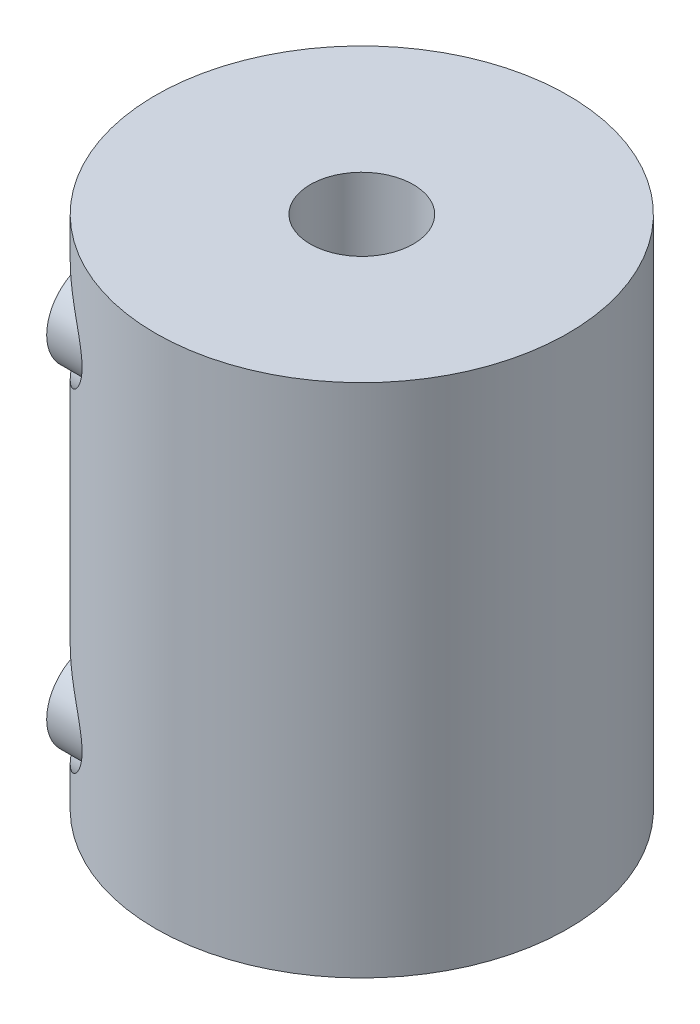
ISO-10303-21;
HEADER;
FILE_DESCRIPTION(('STEP AP214'),'2;1');
FILE_NAME('part.step','',(''),(''),'','','');
FILE_SCHEMA(('AUTOMOTIVE_DESIGN { 1 0 10303 214 1 1 1 1 }'));
ENDSEC;
DATA;
#1=APPLICATION_CONTEXT('core data for automotive mechanical design processes');
#2=APPLICATION_PROTOCOL_DEFINITION('international standard','automotive_design',2000,#1);
#3=PRODUCT_CONTEXT('',#1,'mechanical');
#4=PRODUCT('Part','Part','',(#3));
#5=PRODUCT_RELATED_PRODUCT_CATEGORY('part','',(#4));
#6=PRODUCT_DEFINITION_FORMATION('','',#4);
#7=PRODUCT_DEFINITION_CONTEXT('part definition',#1,'design');
#8=PRODUCT_DEFINITION('design','',#6,#7);
#9=PRODUCT_DEFINITION_SHAPE('','',#8);
#10=(LENGTH_UNIT() NAMED_UNIT(*) SI_UNIT(.MILLI.,.METRE.));
#11=(NAMED_UNIT(*) PLANE_ANGLE_UNIT() SI_UNIT($,.RADIAN.));
#12=(NAMED_UNIT(*) SI_UNIT($,.STERADIAN.) SOLID_ANGLE_UNIT());
#13=UNCERTAINTY_MEASURE_WITH_UNIT(LENGTH_MEASURE(1.E-05),#10,'distance_accuracy_value','');
#14=(GEOMETRIC_REPRESENTATION_CONTEXT(3) GLOBAL_UNCERTAINTY_ASSIGNED_CONTEXT((#13)) GLOBAL_UNIT_ASSIGNED_CONTEXT((#10,
#11,#12)) REPRESENTATION_CONTEXT('',''));
#15=CARTESIAN_POINT('',(0.,0.,0.));
#16=DIRECTION('',(0.,0.,1.));
#17=DIRECTION('',(1.,0.,0.));
#18=AXIS2_PLACEMENT_3D('',#15,#16,#17);
#19=CARTESIAN_POINT('',(-4.,20.5708012580592,6.07877143100646));
#20=DIRECTION('',(1.,0.,0.));
#21=DIRECTION('',(0.,0.,-1.));
#22=AXIS2_PLACEMENT_3D('',#19,#20,#21);
#23=PLANE('',#22);
#24=CARTESIAN_POINT('',(-4.,20.5708012580592,6.07877143100646));
#25=DIRECTION('',(1.,0.,0.));
#26=DIRECTION('',(0.,0.,-1.));
#27=AXIS2_PLACEMENT_3D('',#24,#25,#26);
#28=CIRCLE('',#27,2.70270127481483);
#29=CARTESIAN_POINT('',(-4.,20.5708012580592,3.37607015619163));
#30=VERTEX_POINT('',#29);
#31=EDGE_CURVE('E58',#30,#30,#28,.T.);
#32=ORIENTED_EDGE('',*,*,#31,.F.);
#33=EDGE_LOOP('',(#32));
#34=FACE_BOUND('',#33,.T.);
#35=CARTESIAN_POINT('',(-4.,20.5708012580592,6.07877143100646));
#36=DIRECTION('',(1.,0.,0.));
#37=DIRECTION('',(0.,0.,-1.));
#38=AXIS2_PLACEMENT_3D('',#35,#36,#37);
#39=CIRCLE('',#38,2.20270127481482);
#40=CARTESIAN_POINT('',(-4.,20.5708012580592,3.87607015619163));
#41=VERTEX_POINT('',#40);
#42=EDGE_CURVE('E10',#41,#41,#39,.F.);
#43=ORIENTED_EDGE('',*,*,#42,.F.);
#44=EDGE_LOOP('',(#43));
#45=FACE_BOUND('',#44,.T.);
#46=ADVANCED_FACE('F30',(#34,#45),#23,.F.);
#47=CARTESIAN_POINT('',(-4.,4.4291987419408,6.07877143100646));
#48=DIRECTION('',(-1.,0.,0.));
#49=DIRECTION('',(0.,0.,1.));
#50=AXIS2_PLACEMENT_3D('',#47,#48,#49);
#51=PLANE('',#50);
#52=CARTESIAN_POINT('',(-4.,4.4291987419408,6.07877143100646));
#53=DIRECTION('',(1.,0.,0.));
#54=DIRECTION('',(0.,0.,1.));
#55=AXIS2_PLACEMENT_3D('',#52,#53,#54);
#56=CIRCLE('',#55,2.70270127481483);
#57=CARTESIAN_POINT('',(-4.,4.4291987419408,8.78147270582128));
#58=VERTEX_POINT('',#57);
#59=EDGE_CURVE('E98',#58,#58,#56,.T.);
#60=ORIENTED_EDGE('',*,*,#59,.F.);
#61=EDGE_LOOP('',(#60));
#62=FACE_BOUND('',#61,.T.);
#63=CARTESIAN_POINT('',(-4.,4.4291987419408,6.07877143100646));
#64=DIRECTION('',(-1.,0.,0.));
#65=DIRECTION('',(0.,0.,1.));
#66=AXIS2_PLACEMENT_3D('',#63,#64,#65);
#67=CIRCLE('',#66,2.20270127481482);
#68=CARTESIAN_POINT('',(-4.,4.4291987419408,8.28147270582128));
#69=VERTEX_POINT('',#68);
#70=EDGE_CURVE('E109',#69,#69,#67,.T.);
#71=ORIENTED_EDGE('',*,*,#70,.F.);
#72=EDGE_LOOP('',(#71));
#73=FACE_BOUND('',#72,.T.);
#74=ADVANCED_FACE('F77',(#62,#73),#51,.T.);
#75=CARTESIAN_POINT('',(0.,25.,0.));
#76=DIRECTION('',(0.,1.,0.));
#77=DIRECTION('',(0.,0.,1.));
#78=AXIS2_PLACEMENT_3D('',#75,#76,#77);
#79=PLANE('',#78);
#80=CARTESIAN_POINT('',(0.,25.,0.));
#81=DIRECTION('',(0.,1.,0.));
#82=DIRECTION('',(0.,0.,1.));
#83=AXIS2_PLACEMENT_3D('',#80,#81,#82);
#84=CIRCLE('',#83,10.);
#85=CARTESIAN_POINT('',(0.,25.,10.));
#86=VERTEX_POINT('',#85);
#87=EDGE_CURVE('E38',#86,#86,#84,.T.);
#88=ORIENTED_EDGE('',*,*,#87,.T.);
#89=EDGE_LOOP('',(#88));
#90=FACE_BOUND('',#89,.T.);
#91=CARTESIAN_POINT('',(0.,25.,0.));
#92=DIRECTION('',(0.,1.,0.));
#93=DIRECTION('',(0.,0.,1.));
#94=AXIS2_PLACEMENT_3D('',#91,#92,#93);
#95=CIRCLE('',#94,2.5);
#96=CARTESIAN_POINT('',(0.,25.,2.5));
#97=VERTEX_POINT('',#96);
#98=EDGE_CURVE('E47',#97,#97,#95,.T.);
#99=ORIENTED_EDGE('',*,*,#98,.F.);
#100=EDGE_LOOP('',(#99));
#101=FACE_BOUND('',#100,.T.);
#102=ADVANCED_FACE('F74',(#90,#101),#79,.T.);
#103=CARTESIAN_POINT('',(0.,0.,0.));
#104=DIRECTION('',(0.,1.,0.));
#105=DIRECTION('',(0.,0.,1.));
#106=AXIS2_PLACEMENT_3D('',#103,#104,#105);
#107=PLANE('',#106);
#108=CARTESIAN_POINT('',(0.,0.,0.));
#109=DIRECTION('',(0.,1.,0.));
#110=DIRECTION('',(0.,0.,1.));
#111=AXIS2_PLACEMENT_3D('',#108,#109,#110);
#112=CIRCLE('',#111,10.);
#113=CARTESIAN_POINT('',(0.,0.,10.));
#114=VERTEX_POINT('',#113);
#115=EDGE_CURVE('E42',#114,#114,#112,.T.);
#116=ORIENTED_EDGE('',*,*,#115,.F.);
#117=EDGE_LOOP('',(#116));
#118=FACE_BOUND('',#117,.T.);
#119=CARTESIAN_POINT('',(0.,0.,0.));
#120=DIRECTION('',(0.,1.,0.));
#121=DIRECTION('',(0.,0.,1.));
#122=AXIS2_PLACEMENT_3D('',#119,#120,#121);
#123=CIRCLE('',#122,2.5);
#124=CARTESIAN_POINT('',(0.,0.,2.5));
#125=VERTEX_POINT('',#124);
#126=EDGE_CURVE('E50',#125,#125,#123,.T.);
#127=ORIENTED_EDGE('',*,*,#126,.T.);
#128=EDGE_LOOP('',(#127));
#129=FACE_BOUND('',#128,.T.);
#130=ADVANCED_FACE('F76',(#118,#129),#107,.F.);
#131=CARTESIAN_POINT('',(0.,25.,0.));
#132=DIRECTION('',(0.,-1.,0.));
#133=DIRECTION('',(0.,0.,-1.));
#134=AXIS2_PLACEMENT_3D('',#131,#132,#133);
#135=CYLINDRICAL_SURFACE('',#134,10.);
#136=CARTESIAN_POINT('',(-9.41287152257334,4.4291987419408,3.37607015619163));
#137=CARTESIAN_POINT('',(-9.41287170358848,4.57268791201971,3.37607574239631));
#138=CARTESIAN_POINT('',(-9.40877635293338,4.71639620092479,3.38755555475486));
#139=CARTESIAN_POINT('',(-9.39225124927036,4.99992062447576,3.4331013793446));
#140=CARTESIAN_POINT('',(-9.37980201381852,5.13972686329222,3.46722018683843));
#141=CARTESIAN_POINT('',(-9.34623740309843,5.41109194005285,3.55669950227695));
#142=CARTESIAN_POINT('',(-9.325133087973,5.54266105761148,3.61203289469654));
#143=CARTESIAN_POINT('',(-9.27385782296827,5.79401895131298,3.74171017470993));
#144=CARTESIAN_POINT('',(-9.2436921233727,5.91381449601491,3.8160430500482));
#145=CARTESIAN_POINT('',(-9.17364266298258,6.13971003432133,3.98150653207227));
#146=CARTESIAN_POINT('',(-9.13367413625076,6.24567750183792,4.07278187073851));
#147=CARTESIAN_POINT('',(-9.04407642948478,6.44038923370291,4.26804449255298));
#148=CARTESIAN_POINT('',(-8.99444520019057,6.52912983660157,4.37203447047081));
#149=CARTESIAN_POINT('',(-8.88340464121342,6.69161798216066,4.59359495253422));
#150=CARTESIAN_POINT('',(-8.82157300466659,6.76453354668535,4.71156176875));
#151=CARTESIAN_POINT('',(-8.68842387976626,6.88995150175624,4.95280624589838));
#152=CARTESIAN_POINT('',(-8.61710375442543,6.94244820163556,5.07608537673671));
#153=CARTESIAN_POINT('',(-8.45823071327222,7.03215567049924,5.33703968629217));
#154=CARTESIAN_POINT('',(-8.36976198129616,7.06722690003588,5.47488634467264));
#155=CARTESIAN_POINT('',(-8.1841773556559,7.11526227824561,5.74861990264552));
#156=CARTESIAN_POINT('',(-8.08705500612002,7.12820977413978,5.88450524972293));
#157=CARTESIAN_POINT('',(-7.91350894506532,7.13339773012378,6.11482882588853));
#158=CARTESIAN_POINT('',(-7.83870011773502,7.13033767470723,6.21042716215536));
#159=CARTESIAN_POINT('',(-7.68605857394195,7.11459326228412,6.39837403328097));
#160=CARTESIAN_POINT('',(-7.60822474570437,7.10190533440637,6.49072134907172));
#161=CARTESIAN_POINT('',(-7.37084352663258,7.05053505278778,6.76227006651983));
#162=CARTESIAN_POINT('',(-7.20751173530161,6.99854542577211,6.93585213009231));
#163=CARTESIAN_POINT('',(-6.95751894500966,6.89732099312728,7.18380998235799));
#164=CARTESIAN_POINT('',(-6.87266853634149,6.85931325584528,7.26498080493488));
#165=CARTESIAN_POINT('',(-6.70218925872653,6.77586073175145,7.42253892694468));
#166=CARTESIAN_POINT('',(-6.6165606629294,6.7304184660083,7.4989278358384));
#167=CARTESIAN_POINT('',(-6.44515036305316,6.63235432519728,7.64675488485333));
#168=CARTESIAN_POINT('',(-6.35936864810905,6.57973191888882,7.71819265806214));
#169=CARTESIAN_POINT('',(-6.18838067591292,6.46736557555903,7.85595216304587));
#170=CARTESIAN_POINT('',(-6.10317429555046,6.40762321661344,7.92227502314915));
#171=CARTESIAN_POINT('',(-5.95446079814603,6.29600116915682,8.03435596900492));
#172=CARTESIAN_POINT('',(-5.89064038858361,6.24566110417131,8.08123723632092));
#173=CARTESIAN_POINT('',(-5.76438193128195,6.1405537276845,8.17177647580737));
#174=CARTESIAN_POINT('',(-5.7019436321116,6.08578723000543,8.21543503767733));
#175=CARTESIAN_POINT('',(-5.5791976718532,5.97158154175528,8.29928115412992));
#176=CARTESIAN_POINT('',(-5.51888745946011,5.91214824247868,8.33947295468534));
#177=CARTESIAN_POINT('',(-5.4012900509879,5.78814285444716,8.41611486397308));
#178=CARTESIAN_POINT('',(-5.34400135057782,5.72357336380808,8.45256684337404));
#179=CARTESIAN_POINT('',(-5.22358061918759,5.57629759564939,8.52760831334518));
#180=CARTESIAN_POINT('',(-5.16131130575061,5.49243959596831,8.56535822797639));
#181=CARTESIAN_POINT('',(-5.04618063021486,5.3157386059986,8.63368559458735));
#182=CARTESIAN_POINT('',(-4.99330625273783,5.22290832540508,8.66427298822903));
#183=CARTESIAN_POINT('',(-4.91312294816862,5.05163916653972,8.70992660757096));
#184=CARTESIAN_POINT('',(-4.88272388575854,4.97520191343707,8.72695867898681));
#185=CARTESIAN_POINT('',(-4.83300146775689,4.81769931850051,8.75459390723961));
#186=CARTESIAN_POINT('',(-4.81366017985592,4.73664170562065,8.76520747454052));
#187=CARTESIAN_POINT('',(-4.78839042351357,4.57096485140521,8.77904014647308));
#188=CARTESIAN_POINT('',(-4.78258942414667,4.48631934045392,8.78218898196885));
#189=CARTESIAN_POINT('',(-4.78572659345228,4.31737523228547,8.78047962467429));
#190=CARTESIAN_POINT('',(-4.7946672870692,4.23307669697728,8.77562006021222));
#191=CARTESIAN_POINT('',(-4.82387117556576,4.07839009375443,8.75959392248449));
#192=CARTESIAN_POINT('',(-4.8425537223217,4.00759421306915,8.74930587932604));
#193=CARTESIAN_POINT('',(-4.88824920184732,3.86970985238327,8.72385852979211));
#194=CARTESIAN_POINT('',(-4.91526579746616,3.80262301784211,8.70869708141147));
#195=CARTESIAN_POINT('',(-4.99849776796999,3.62366520043174,8.66133253703916));
#196=CARTESIAN_POINT('',(-5.06139316538612,3.51605179338266,8.62488771299013));
#197=CARTESIAN_POINT('',(-5.19919475912646,3.31269040569874,8.54253305333394));
#198=CARTESIAN_POINT('',(-5.27414700745267,3.2169905207125,8.49658672579656));
#199=CARTESIAN_POINT('',(-5.42242772319133,3.04620307794156,8.40262598494784));
#200=CARTESIAN_POINT('',(-5.49500650885068,2.97000695832834,8.35541248845619));
#201=CARTESIAN_POINT('',(-5.64380254088141,2.82495061416298,8.25563603315062));
#202=CARTESIAN_POINT('',(-5.72002251094445,2.75609600971098,8.20306903544288));
#203=CARTESIAN_POINT('',(-5.87474031335049,2.62507885908382,8.09298800508659));
#204=CARTESIAN_POINT('',(-5.95324023788644,2.56292272294929,8.03546932698562));
#205=CARTESIAN_POINT('',(-6.11145633334639,2.44502133072234,7.91580324429936));
#206=CARTESIAN_POINT('',(-6.19117218884879,2.38927444301203,7.85365702442585));
#207=CARTESIAN_POINT('',(-6.35699487691695,2.2801455542367,7.72015304710964));
#208=CARTESIAN_POINT('',(-6.44314034144478,2.22723944176156,7.6484539649779));
#209=CARTESIAN_POINT('',(-6.61528579226342,2.12866291683789,7.50006104187412));
#210=CARTESIAN_POINT('',(-6.70128575936886,2.08299339467006,7.42336658798223));
#211=CARTESIAN_POINT('',(-6.8724217626668,1.99919077059402,7.26521619448331));
#212=CARTESIAN_POINT('',(-6.95755858224746,1.96105011916146,7.18376513186257));
#213=CARTESIAN_POINT('',(-7.12646081474712,1.8926807052713,7.01624886989317));
#214=CARTESIAN_POINT('',(-7.21022582005109,1.86245425580797,6.9301823304661));
#215=CARTESIAN_POINT('',(-7.44447431279643,1.78896067667105,6.68046081624987));
#216=CARTESIAN_POINT('',(-7.59278915946169,1.755610200027,6.51155366469374));
#217=CARTESIAN_POINT('',(-7.80734562170064,1.73048113944749,6.24965389585184));
#218=CARTESIAN_POINT('',(-7.87754274579429,1.72625393109222,6.1609341619696));
#219=CARTESIAN_POINT('',(-8.0148647544386,1.72676297015406,5.98119842853384));
#220=CARTESIAN_POINT('',(-8.08199033800085,1.73149716766726,5.89018295882429));
#221=CARTESIAN_POINT('',(-8.25259490345464,1.75652661473205,5.65043734171583));
#222=CARTESIAN_POINT('',(-8.35328206922771,1.78455035274661,5.50035634097726));
#223=CARTESIAN_POINT('',(-8.49557541756497,1.8473851138219,5.27571307517442));
#224=CARTESIAN_POINT('',(-8.54156549278094,1.87180927860438,5.2008844620038));
#225=CARTESIAN_POINT('',(-8.63041443199694,1.92784079258516,5.05207147707333));
#226=CARTESIAN_POINT('',(-8.67327467218364,1.95944495930253,4.9780867464815));
#227=CARTESIAN_POINT('',(-8.7559806698923,2.0302956643015,4.83114659982009));
#228=CARTESIAN_POINT('',(-8.7957981086164,2.06960411695106,4.75820503388392));
#229=CARTESIAN_POINT('',(-8.87180276303877,2.15570424055961,4.61494168658613));
#230=CARTESIAN_POINT('',(-8.90799184142329,2.2024920395173,4.54461857277101));
#231=CARTESIAN_POINT('',(-8.97660634732807,2.30344752924503,4.40754025220503));
#232=CARTESIAN_POINT('',(-9.00903294196045,2.35761292011177,4.34078394252664));
#233=CARTESIAN_POINT('',(-9.07003617401587,2.4730200176227,4.21183319485044));
#234=CARTESIAN_POINT('',(-9.09861343710701,2.5342605712607,4.14963801623954));
#235=CARTESIAN_POINT('',(-9.17145319933534,2.71085664524801,3.98712565975882));
#236=CARTESIAN_POINT('',(-9.21186644422536,2.83298505904897,3.89226622058019));
#237=CARTESIAN_POINT('',(-9.28126096897066,3.09399096431447,3.7237851520387));
#238=CARTESIAN_POINT('',(-9.31024100011708,3.23287028311201,3.65016584270893));
#239=CARTESIAN_POINT('',(-9.35552394992088,3.51173582422837,3.53239938929729));
#240=CARTESIAN_POINT('',(-9.37262566554501,3.65082841260367,3.48643156421485));
#241=CARTESIAN_POINT('',(-9.39794352393567,3.9351472676366,3.41760581624384));
#242=CARTESIAN_POINT('',(-9.40618260427217,4.08035668489846,3.39468824656066));
#243=CARTESIAN_POINT('',(-9.41104704070995,4.26008847314481,3.38115231158862));
#244=CARTESIAN_POINT('',(-9.41173124432172,4.29387551395957,3.37924795706182));
#245=CARTESIAN_POINT('',(-9.41264346600973,4.3615038845319,3.37670621452454));
#246=CARTESIAN_POINT('',(-9.41287147986628,4.39534521478874,3.37606883823341));
#247=CARTESIAN_POINT('',(-9.41287152257334,4.4291987419408,3.37607015619163));
#248=B_SPLINE_CURVE_WITH_KNOTS('',3,(#136,#137,#138,#139,#140,#141,#142,#143,#144,#145,#146,
#147,#148,#149,#150,#151,#152,#153,#154,#155,#156,#157,#158,#159,#160,#161,#162,#163,#164,#165,
#166,#167,#168,#169,#170,#171,#172,#173,#174,#175,#176,#177,#178,#179,#180,#181,#182,#183,#184,
#185,#186,#187,#188,#189,#190,#191,#192,#193,#194,#195,#196,#197,#198,#199,#200,#201,#202,#203,
#204,#205,#206,#207,#208,#209,#210,#211,#212,#213,#214,#215,#216,#217,#218,#219,#220,#221,#222,
#223,#224,#225,#226,#227,#228,#229,#230,#231,#232,#233,#234,#235,#236,#237,#238,#239,#240,#241,
#242,#243,#244,#245,#246,#247),.UNSPECIFIED.,.T.,.F.,(4,2,2,2,2,2,2,2,2,2,2,2,2,2,2,2,2,2,2,2,2,
2,2,2,2,2,2,2,2,2,2,2,2,2,2,2,2,2,2,2,2,2,2,2,2,2,2,2,2,2,2,2,2,2,2,4),(0.,0.430335407766469,
0.861677922880866,1.29247094360294,1.72301483715128,2.15742174569959,2.59192088355453,
3.0455471611502,3.49929977238735,3.99993052006777,4.50093793232002,4.86475017002683,
5.22869740765189,5.95706041071147,6.32710458105673,6.69702352752886,7.06696985823202,
7.43683434550068,7.71818946086366,7.99949296481218,8.28044689506457,8.56125959911838,
8.89371094604609,9.22569807461829,9.47682678344994,9.72754707506411,9.98061830575278,
10.2337328867658,10.4547301089697,10.675824599091,11.0631718304472,11.4520353155709,
11.7975686655009,12.1433646582901,12.48948867295,12.8355243779578,13.2070235401041,
13.5785683704665,13.9497387227737,14.3210174320611,14.999630299309,15.3389121956359,
15.6781164912774,16.2241605957275,16.4973822123701,16.7704829610822,17.0458757759606,
17.3211264810255,17.5962915745171,17.8714118887264,18.3481143623488,18.8248688858961,
19.2652328276647,19.7044542917315,19.8059827670157,19.9075121814189),.UNSPECIFIED.);
#249=CARTESIAN_POINT('',(-9.41287152257334,4.4291987419408,3.37607015619163));
#250=VERTEX_POINT('',#249);
#251=EDGE_CURVE('E59',#250,#250,#248,.T.);
#252=ORIENTED_EDGE('',*,*,#251,.T.);
#253=EDGE_LOOP('',(#252));
#254=FACE_BOUND('',#253,.T.);
#255=CARTESIAN_POINT('',(-9.41287152257334,20.5708012580592,3.37607015619163));
#256=CARTESIAN_POINT('',(-9.41287170358848,20.7142904281381,3.37607574239631));
#257=CARTESIAN_POINT('',(-9.40877635293338,20.8579987170432,3.38755555475486));
#258=CARTESIAN_POINT('',(-9.39225124927036,21.1415231405942,3.4331013793446));
#259=CARTESIAN_POINT('',(-9.37980201381852,21.2813293794106,3.46722018683843));
#260=CARTESIAN_POINT('',(-9.34623740309843,21.5526944561712,3.55669950227695));
#261=CARTESIAN_POINT('',(-9.325133087973,21.6842635737299,3.61203289469654));
#262=CARTESIAN_POINT('',(-9.27385782296827,21.9356214674314,3.74171017470992));
#263=CARTESIAN_POINT('',(-9.2436921233727,22.0554170121333,3.8160430500482));
#264=CARTESIAN_POINT('',(-9.17364266298258,22.2813125504397,3.98150653207227));
#265=CARTESIAN_POINT('',(-9.13367413625076,22.3872800179563,4.07278187073851));
#266=CARTESIAN_POINT('',(-9.04407642948478,22.5819917498213,4.26804449255297));
#267=CARTESIAN_POINT('',(-8.99444520019057,22.67073235272,4.37203447047081));
#268=CARTESIAN_POINT('',(-8.88340464121342,22.8332204982791,4.59359495253422));
#269=CARTESIAN_POINT('',(-8.82157300466659,22.9061360628037,4.71156176874999));
#270=CARTESIAN_POINT('',(-8.68842387976626,23.0315540178746,4.95280624589838));
#271=CARTESIAN_POINT('',(-8.61710375442543,23.084050717754,5.07608537673671));
#272=CARTESIAN_POINT('',(-8.45823071327222,23.1737581866176,5.33703968629217));
#273=CARTESIAN_POINT('',(-8.36976198129615,23.2088294161543,5.47488634467264));
#274=CARTESIAN_POINT('',(-8.1841773556559,23.256864794364,5.74861990264552));
#275=CARTESIAN_POINT('',(-8.08705500612002,23.2698122902582,5.88450524972293));
#276=CARTESIAN_POINT('',(-7.91350894506532,23.2750002462422,6.11482882588853));
#277=CARTESIAN_POINT('',(-7.83870011773502,23.2719401908256,6.21042716215536));
#278=CARTESIAN_POINT('',(-7.68605857394195,23.2561957784025,6.39837403328097));
#279=CARTESIAN_POINT('',(-7.60822474570437,23.2435078505248,6.49072134907172));
#280=CARTESIAN_POINT('',(-7.37084352663258,23.1921375689062,6.76227006651983));
#281=CARTESIAN_POINT('',(-7.2075117353016,23.1401479418905,6.93585213009231));
#282=CARTESIAN_POINT('',(-6.95751894500966,23.0389235092457,7.18380998235799));
#283=CARTESIAN_POINT('',(-6.87266853634149,23.0009157719637,7.26498080493488));
#284=CARTESIAN_POINT('',(-6.70218925872653,22.9174632478698,7.42253892694468));
#285=CARTESIAN_POINT('',(-6.61656066292939,22.8720209821267,7.4989278358384));
#286=CARTESIAN_POINT('',(-6.44515036305315,22.7739568413157,7.64675488485333));
#287=CARTESIAN_POINT('',(-6.35936864810905,22.7213344350072,7.71819265806214));
#288=CARTESIAN_POINT('',(-6.18838067591292,22.6089680916774,7.85595216304587));
#289=CARTESIAN_POINT('',(-6.10317429555047,22.5492257327318,7.92227502314915));
#290=CARTESIAN_POINT('',(-5.95446079814603,22.4376036852752,8.03435596900492));
#291=CARTESIAN_POINT('',(-5.89064038858361,22.3872636202897,8.08123723632092));
#292=CARTESIAN_POINT('',(-5.76438193128195,22.2821562438029,8.17177647580736));
#293=CARTESIAN_POINT('',(-5.7019436321116,22.2273897461238,8.21543503767732));
#294=CARTESIAN_POINT('',(-5.57919767185321,22.1131840578737,8.29928115412992));
#295=CARTESIAN_POINT('',(-5.51888745946012,22.0537507585971,8.33947295468534));
#296=CARTESIAN_POINT('',(-5.4012900509879,21.9297453705656,8.41611486397307));
#297=CARTESIAN_POINT('',(-5.34400135057782,21.8651758799265,8.45256684337404));
#298=CARTESIAN_POINT('',(-5.22358061918759,21.7179001117678,8.52760831334518));
#299=CARTESIAN_POINT('',(-5.16131130575061,21.6340421120867,8.56535822797639));
#300=CARTESIAN_POINT('',(-5.04618063021486,21.457341122117,8.63368559458734));
#301=CARTESIAN_POINT('',(-4.99330625273783,21.3645108415235,8.66427298822902));
#302=CARTESIAN_POINT('',(-4.91312294816862,21.1932416826581,8.70992660757096));
#303=CARTESIAN_POINT('',(-4.88272388575854,21.1168044295555,8.72695867898681));
#304=CARTESIAN_POINT('',(-4.83300146775689,20.9593018346189,8.75459390723961));
#305=CARTESIAN_POINT('',(-4.81366017985592,20.878244221739,8.76520747454052));
#306=CARTESIAN_POINT('',(-4.78839042351357,20.7125673675236,8.77904014647308));
#307=CARTESIAN_POINT('',(-4.78258942414668,20.6279218565723,8.78218898196885));
#308=CARTESIAN_POINT('',(-4.78572659345228,20.4589777484039,8.78047962467429));
#309=CARTESIAN_POINT('',(-4.7946672870692,20.3746792130957,8.77562006021222));
#310=CARTESIAN_POINT('',(-4.82387117556576,20.2199926098728,8.75959392248449));
#311=CARTESIAN_POINT('',(-4.8425537223217,20.1491967291875,8.74930587932604));
#312=CARTESIAN_POINT('',(-4.88824920184732,20.0113123685017,8.72385852979211));
#313=CARTESIAN_POINT('',(-4.91526579746616,19.9442255339605,8.70869708141147));
#314=CARTESIAN_POINT('',(-4.99849776796999,19.7652677165501,8.66133253703916));
#315=CARTESIAN_POINT('',(-5.06139316538612,19.6576543095011,8.62488771299013));
#316=CARTESIAN_POINT('',(-5.19919475912646,19.4542929218171,8.54253305333394));
#317=CARTESIAN_POINT('',(-5.27414700745267,19.3585930368309,8.49658672579656));
#318=CARTESIAN_POINT('',(-5.42242772319133,19.18780559406,8.40262598494784));
#319=CARTESIAN_POINT('',(-5.49500650885069,19.1116094744467,8.35541248845619));
#320=CARTESIAN_POINT('',(-5.64380254088141,18.9665531302814,8.25563603315062));
#321=CARTESIAN_POINT('',(-5.72002251094446,18.8976985258294,8.20306903544287));
#322=CARTESIAN_POINT('',(-5.8747403133505,18.7666813752022,8.09298800508659));
#323=CARTESIAN_POINT('',(-5.95324023788644,18.7045252390677,8.03546932698561));
#324=CARTESIAN_POINT('',(-6.1114563333464,18.5866238468407,7.91580324429936));
#325=CARTESIAN_POINT('',(-6.1911721888488,18.5308769591304,7.85365702442584));
#326=CARTESIAN_POINT('',(-6.35699487691696,18.4217480703551,7.72015304710963));
#327=CARTESIAN_POINT('',(-6.44314034144479,18.3688419578799,7.64845396497789));
#328=CARTESIAN_POINT('',(-6.61528579226343,18.2702654329563,7.50006104187411));
#329=CARTESIAN_POINT('',(-6.70128575936887,18.2245959107884,7.42336658798222));
#330=CARTESIAN_POINT('',(-6.87242176266682,18.1407932867124,7.2652161944833));
#331=CARTESIAN_POINT('',(-6.95755858224747,18.1026526352798,7.18376513186256));
#332=CARTESIAN_POINT('',(-7.12646081474713,18.0342832213897,7.01624886989316));
#333=CARTESIAN_POINT('',(-7.2102258200511,18.0040567719264,6.93018233046609));
#334=CARTESIAN_POINT('',(-7.44447431279644,17.9305631927894,6.68046081624986));
#335=CARTESIAN_POINT('',(-7.5927891594617,17.8972127161454,6.51155366469373));
#336=CARTESIAN_POINT('',(-7.80734562170065,17.8720836555659,6.24965389585183));
#337=CARTESIAN_POINT('',(-7.8775427457943,17.8678564472106,6.16093416196959));
#338=CARTESIAN_POINT('',(-8.01486475443861,17.8683654862725,5.98119842853383));
#339=CARTESIAN_POINT('',(-8.08199033800086,17.8730996837857,5.89018295882428));
#340=CARTESIAN_POINT('',(-8.25259490345465,17.8981291308504,5.65043734171582));
#341=CARTESIAN_POINT('',(-8.35328206922771,17.926152868865,5.50035634097725));
#342=CARTESIAN_POINT('',(-8.49557541756497,17.9889876299403,5.27571307517441));
#343=CARTESIAN_POINT('',(-8.54156549278095,18.0134117947228,5.20088446200379));
#344=CARTESIAN_POINT('',(-8.63041443199695,18.0694433087036,5.05207147707332));
#345=CARTESIAN_POINT('',(-8.67327467218365,18.1010474754209,4.97808674648149));
#346=CARTESIAN_POINT('',(-8.75598066989231,18.1718981804199,4.83114659982008));
#347=CARTESIAN_POINT('',(-8.79579810861641,18.2112066330695,4.75820503388391));
#348=CARTESIAN_POINT('',(-8.87180276303877,18.297306756678,4.61494168658612));
#349=CARTESIAN_POINT('',(-8.90799184142329,18.3440945556357,4.544618572771));
#350=CARTESIAN_POINT('',(-8.97660634732808,18.4450500453634,4.40754025220502));
#351=CARTESIAN_POINT('',(-9.00903294196046,18.4992154362302,4.34078394252663));
#352=CARTESIAN_POINT('',(-9.07003617401588,18.6146225337411,4.21183319485043));
#353=CARTESIAN_POINT('',(-9.09861343710701,18.6758630873791,4.14963801623953));
#354=CARTESIAN_POINT('',(-9.17145319933534,18.8524591613664,3.98712565975882));
#355=CARTESIAN_POINT('',(-9.21186644422536,18.9745875751674,3.89226622058018));
#356=CARTESIAN_POINT('',(-9.28126096897066,19.2355934804329,3.7237851520387));
#357=CARTESIAN_POINT('',(-9.31024100011708,19.3744727992304,3.65016584270893));
#358=CARTESIAN_POINT('',(-9.35552394992088,19.6533383403468,3.53239938929728));
#359=CARTESIAN_POINT('',(-9.37262566554502,19.7924309287221,3.48643156421485));
#360=CARTESIAN_POINT('',(-9.39794352393567,20.076749783755,3.41760581624384));
#361=CARTESIAN_POINT('',(-9.40618260427217,20.2219592010169,3.39468824656066));
#362=CARTESIAN_POINT('',(-9.41104704070995,20.4016909892632,3.38115231158862));
#363=CARTESIAN_POINT('',(-9.41173124432172,20.435478030078,3.37924795706182));
#364=CARTESIAN_POINT('',(-9.41264346600973,20.5031064006503,3.37670621452454));
#365=CARTESIAN_POINT('',(-9.41287147986628,20.5369477309071,3.37606883823341));
#366=CARTESIAN_POINT('',(-9.41287152257334,20.5708012580592,3.37607015619163));
#367=B_SPLINE_CURVE_WITH_KNOTS('',3,(#255,#256,#257,#258,#259,#260,#261,#262,#263,#264,#265,
#266,#267,#268,#269,#270,#271,#272,#273,#274,#275,#276,#277,#278,#279,#280,#281,#282,#283,#284,
#285,#286,#287,#288,#289,#290,#291,#292,#293,#294,#295,#296,#297,#298,#299,#300,#301,#302,#303,
#304,#305,#306,#307,#308,#309,#310,#311,#312,#313,#314,#315,#316,#317,#318,#319,#320,#321,#322,
#323,#324,#325,#326,#327,#328,#329,#330,#331,#332,#333,#334,#335,#336,#337,#338,#339,#340,#341,
#342,#343,#344,#345,#346,#347,#348,#349,#350,#351,#352,#353,#354,#355,#356,#357,#358,#359,#360,
#361,#362,#363,#364,#365,#366),.UNSPECIFIED.,.T.,.F.,(4,2,2,2,2,2,2,2,2,2,2,2,2,2,2,2,2,2,2,2,2,
2,2,2,2,2,2,2,2,2,2,2,2,2,2,2,2,2,2,2,2,2,2,2,2,2,2,2,2,2,2,2,2,2,2,4),(0.,0.430335407766469,
0.861677922880865,1.29247094360294,1.72301483715127,2.15742174569959,2.59192088355453,
3.0455471611502,3.49929977238735,3.99993052006776,4.50093793232002,4.86475017002683,
5.22869740765189,5.95706041071147,6.32710458105673,6.69702352752886,7.06696985823202,
7.43683434550068,7.71818946086366,7.99949296481217,8.28044689506457,8.56125959911837,
8.89371094604608,9.22569807461828,9.47682678344993,9.72754707506411,9.98061830575278,
10.2337328867658,10.4547301089697,10.675824599091,11.0631718304472,11.4520353155709,
11.7975686655009,12.1433646582901,12.48948867295,12.8355243779578,13.2070235401041,
13.5785683704665,13.9497387227737,14.3210174320612,14.999630299309,15.3389121956359,
15.6781164912774,16.2241605957275,16.4973822123701,16.7704829610823,17.0458757759607,
17.3211264810256,17.5962915745171,17.8714118887264,18.3481143623488,18.8248688858961,
19.2652328276647,19.7044542917315,19.8059827670157,19.9075121814189),.UNSPECIFIED.);
#368=CARTESIAN_POINT('',(-9.41287152257334,20.5708012580592,3.37607015619163));
#369=VERTEX_POINT('',#368);
#370=EDGE_CURVE('E53',#369,#369,#367,.T.);
#371=ORIENTED_EDGE('',*,*,#370,.T.);
#372=EDGE_LOOP('',(#371));
#373=FACE_BOUND('',#372,.T.);
#374=ORIENTED_EDGE('',*,*,#87,.F.);
#375=EDGE_LOOP('',(#374));
#376=FACE_BOUND('',#375,.T.);
#377=ORIENTED_EDGE('',*,*,#115,.T.);
#378=EDGE_LOOP('',(#377));
#379=FACE_BOUND('',#378,.T.);
#380=ADVANCED_FACE('F32',(#254,#373,#376,#379),#135,.T.);
#381=CARTESIAN_POINT('',(0.,25.,0.));
#382=DIRECTION('',(0.,-1.,0.));
#383=DIRECTION('',(0.,0.,-1.));
#384=AXIS2_PLACEMENT_3D('',#381,#382,#383);
#385=CYLINDRICAL_SURFACE('',#384,2.5);
#386=ORIENTED_EDGE('',*,*,#98,.T.);
#387=EDGE_LOOP('',(#386));
#388=FACE_BOUND('',#387,.T.);
#389=ORIENTED_EDGE('',*,*,#126,.F.);
#390=EDGE_LOOP('',(#389));
#391=FACE_BOUND('',#390,.T.);
#392=ADVANCED_FACE('F69',(#388,#391),#385,.F.);
#393=CARTESIAN_POINT('',(-10.,20.5708012580592,6.07877143100646));
#394=DIRECTION('',(1.,0.,0.));
#395=DIRECTION('',(0.,0.,-1.));
#396=AXIS2_PLACEMENT_3D('',#393,#394,#395);
#397=CYLINDRICAL_SURFACE('',#396,2.70270127481483);
#398=ORIENTED_EDGE('',*,*,#31,.T.);
#399=EDGE_LOOP('',(#398));
#400=FACE_BOUND('',#399,.T.);
#401=ORIENTED_EDGE('',*,*,#370,.F.);
#402=EDGE_LOOP('',(#401));
#403=FACE_BOUND('',#402,.T.);
#404=ADVANCED_FACE('F63',(#400,#403),#397,.F.);
#405=CARTESIAN_POINT('',(-10.,4.4291987419408,6.07877143100646));
#406=DIRECTION('',(1.,0.,0.));
#407=DIRECTION('',(0.,0.,-1.));
#408=AXIS2_PLACEMENT_3D('',#405,#406,#407);
#409=CYLINDRICAL_SURFACE('',#408,2.70270127481483);
#410=ORIENTED_EDGE('',*,*,#59,.T.);
#411=EDGE_LOOP('',(#410));
#412=FACE_BOUND('',#411,.T.);
#413=ORIENTED_EDGE('',*,*,#251,.F.);
#414=EDGE_LOOP('',(#413));
#415=FACE_BOUND('',#414,.T.);
#416=ADVANCED_FACE('F68',(#412,#415),#409,.F.);
#417=CARTESIAN_POINT('',(-6.99999999999999,4.4291987419408,6.07877143100646));
#418=DIRECTION('',(1.,0.,0.));
#419=DIRECTION('',(0.,0.,-1.));
#420=AXIS2_PLACEMENT_3D('',#417,#418,#419);
#421=CYLINDRICAL_SURFACE('',#420,2.20270127481482);
#422=CARTESIAN_POINT('',(-6.99999999999999,4.4291987419408,6.07877143100646));
#423=DIRECTION('',(-1.,0.,0.));
#424=DIRECTION('',(0.,0.,1.));
#425=AXIS2_PLACEMENT_3D('',#422,#423,#424);
#426=CIRCLE('',#425,2.20270127481482);
#427=CARTESIAN_POINT('',(-6.99999999999999,4.4291987419408,8.28147270582128));
#428=VERTEX_POINT('',#427);
#429=EDGE_CURVE('E108',#428,#428,#426,.T.);
#430=ORIENTED_EDGE('',*,*,#429,.F.);
#431=EDGE_LOOP('',(#430));
#432=FACE_BOUND('',#431,.T.);
#433=ORIENTED_EDGE('',*,*,#70,.T.);
#434=EDGE_LOOP('',(#433));
#435=FACE_BOUND('',#434,.T.);
#436=ADVANCED_FACE('F129',(#432,#435),#421,.T.);
#437=CARTESIAN_POINT('',(-6.99999999999999,4.4291987419408,6.07877143100646));
#438=DIRECTION('',(-1.,0.,0.));
#439=DIRECTION('',(0.,0.,1.));
#440=AXIS2_PLACEMENT_3D('',#437,#438,#439);
#441=PLANE('',#440);
#442=ORIENTED_EDGE('',*,*,#429,.T.);
#443=EDGE_LOOP('',(#442));
#444=FACE_BOUND('',#443,.T.);
#445=ADVANCED_FACE('F122',(#444),#441,.T.);
#446=CARTESIAN_POINT('',(-6.99999999999999,20.5708012580592,6.07877143100646));
#447=DIRECTION('',(1.,0.,0.));
#448=DIRECTION('',(0.,0.,-1.));
#449=AXIS2_PLACEMENT_3D('',#446,#447,#448);
#450=CYLINDRICAL_SURFACE('',#449,2.20270127481482);
#451=CARTESIAN_POINT('',(-6.99999999999999,20.5708012580592,6.07877143100646));
#452=DIRECTION('',(-1.,0.,0.));
#453=DIRECTION('',(0.,0.,1.));
#454=AXIS2_PLACEMENT_3D('',#451,#452,#453);
#455=CIRCLE('',#454,2.20270127481482);
#456=CARTESIAN_POINT('',(-6.99999999999999,20.5708012580592,8.28147270582128));
#457=VERTEX_POINT('',#456);
#458=EDGE_CURVE('E112',#457,#457,#455,.T.);
#459=ORIENTED_EDGE('',*,*,#458,.F.);
#460=EDGE_LOOP('',(#459));
#461=FACE_BOUND('',#460,.T.);
#462=ORIENTED_EDGE('',*,*,#42,.T.);
#463=EDGE_LOOP('',(#462));
#464=FACE_BOUND('',#463,.T.);
#465=ADVANCED_FACE('F120',(#461,#464),#450,.T.);
#466=CARTESIAN_POINT('',(-6.99999999999999,20.5708012580592,6.07877143100646));
#467=DIRECTION('',(-1.,0.,0.));
#468=DIRECTION('',(0.,0.,1.));
#469=AXIS2_PLACEMENT_3D('',#466,#467,#468);
#470=PLANE('',#469);
#471=ORIENTED_EDGE('',*,*,#458,.T.);
#472=EDGE_LOOP('',(#471));
#473=FACE_BOUND('',#472,.T.);
#474=ADVANCED_FACE('F118',(#473),#470,.T.);
#475=CLOSED_SHELL('',(#46,#74,#102,#130,#380,#392,#404,#416,#436,#445,#465,#474));
#476=MANIFOLD_SOLID_BREP('B2',#475);
#477=ADVANCED_BREP_SHAPE_REPRESENTATION('',(#18,#476),#14);
#478=SHAPE_DEFINITION_REPRESENTATION(#9,#477);
ENDSEC;
END-ISO-10303-21;
